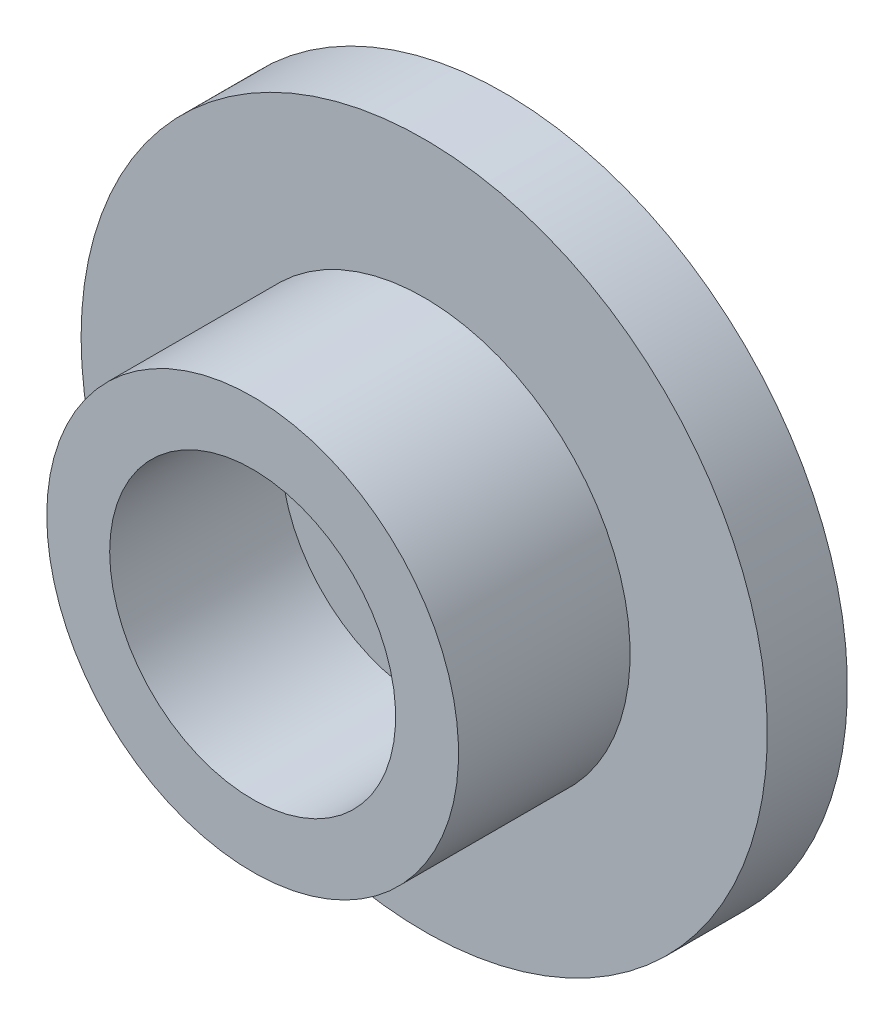
ISO-10303-21;
HEADER;
FILE_DESCRIPTION(('STEP AP214'),'2;1');
FILE_NAME('part.step','',(''),(''),'','','');
FILE_SCHEMA(('AUTOMOTIVE_DESIGN { 1 0 10303 214 1 1 1 1 }'));
ENDSEC;
DATA;
#1=APPLICATION_CONTEXT('core data for automotive mechanical design processes');
#2=APPLICATION_PROTOCOL_DEFINITION('international standard','automotive_design',2000,#1);
#3=PRODUCT_CONTEXT('',#1,'mechanical');
#4=PRODUCT('Part','Part','',(#3));
#5=PRODUCT_RELATED_PRODUCT_CATEGORY('part','',(#4));
#6=PRODUCT_DEFINITION_FORMATION('','',#4);
#7=PRODUCT_DEFINITION_CONTEXT('part definition',#1,'design');
#8=PRODUCT_DEFINITION('design','',#6,#7);
#9=PRODUCT_DEFINITION_SHAPE('','',#8);
#10=(LENGTH_UNIT() NAMED_UNIT(*) SI_UNIT(.MILLI.,.METRE.));
#11=(NAMED_UNIT(*) PLANE_ANGLE_UNIT() SI_UNIT($,.RADIAN.));
#12=(NAMED_UNIT(*) SI_UNIT($,.STERADIAN.) SOLID_ANGLE_UNIT());
#13=UNCERTAINTY_MEASURE_WITH_UNIT(LENGTH_MEASURE(1.E-05),#10,'distance_accuracy_value','');
#14=(GEOMETRIC_REPRESENTATION_CONTEXT(3) GLOBAL_UNCERTAINTY_ASSIGNED_CONTEXT((#13)) GLOBAL_UNIT_ASSIGNED_CONTEXT((#10,
#11,#12)) REPRESENTATION_CONTEXT('',''));
#15=CARTESIAN_POINT('',(0.,0.,0.));
#16=DIRECTION('',(0.,0.,1.));
#17=DIRECTION('',(1.,0.,0.));
#18=AXIS2_PLACEMENT_3D('',#15,#16,#17);
#19=CARTESIAN_POINT('',(0.,0.,0.));
#20=DIRECTION('',(0.,0.,1.));
#21=DIRECTION('',(1.,0.,0.));
#22=AXIS2_PLACEMENT_3D('',#19,#20,#21);
#23=PLANE('',#22);
#24=CARTESIAN_POINT('',(0.,0.,0.));
#25=DIRECTION('',(0.,0.,1.));
#26=DIRECTION('',(1.,0.,0.));
#27=AXIS2_PLACEMENT_3D('',#24,#25,#26);
#28=CIRCLE('',#27,18.);
#29=CARTESIAN_POINT('',(18.,0.,0.));
#30=VERTEX_POINT('',#29);
#31=EDGE_CURVE('E41',#30,#30,#28,.T.);
#32=ORIENTED_EDGE('',*,*,#31,.F.);
#33=EDGE_LOOP('',(#32));
#34=FACE_BOUND('',#33,.T.);
#35=CARTESIAN_POINT('',(0.,0.,0.));
#36=DIRECTION('',(0.,0.,1.));
#37=DIRECTION('',(1.,0.,0.));
#38=AXIS2_PLACEMENT_3D('',#35,#36,#37);
#39=CIRCLE('',#38,12.5);
#40=CARTESIAN_POINT('',(12.5,0.,0.));
#41=VERTEX_POINT('',#40);
#42=EDGE_CURVE('E56',#41,#41,#39,.T.);
#43=ORIENTED_EDGE('',*,*,#42,.T.);
#44=EDGE_LOOP('',(#43));
#45=FACE_BOUND('',#44,.T.);
#46=ADVANCED_FACE('F29',(#34,#45),#23,.F.);
#47=CARTESIAN_POINT('',(0.,0.,7.));
#48=DIRECTION('',(0.,0.,-1.));
#49=DIRECTION('',(-1.,0.,0.));
#50=AXIS2_PLACEMENT_3D('',#47,#48,#49);
#51=CYLINDRICAL_SURFACE('',#50,18.);
#52=CARTESIAN_POINT('',(0.,0.,7.));
#53=DIRECTION('',(0.,0.,-1.));
#54=DIRECTION('',(-1.,0.,0.));
#55=AXIS2_PLACEMENT_3D('',#52,#53,#54);
#56=CIRCLE('',#55,18.);
#57=CARTESIAN_POINT('',(-18.,0.,7.));
#58=VERTEX_POINT('',#57);
#59=EDGE_CURVE('E46',#58,#58,#56,.T.);
#60=ORIENTED_EDGE('',*,*,#59,.T.);
#61=EDGE_LOOP('',(#60));
#62=FACE_BOUND('',#61,.T.);
#63=ORIENTED_EDGE('',*,*,#31,.T.);
#64=EDGE_LOOP('',(#63));
#65=FACE_BOUND('',#64,.T.);
#66=ADVANCED_FACE('F31',(#62,#65),#51,.T.);
#67=CARTESIAN_POINT('',(0.,0.,7.));
#68=DIRECTION('',(0.,0.,-1.));
#69=DIRECTION('',(-1.,0.,0.));
#70=AXIS2_PLACEMENT_3D('',#67,#68,#69);
#71=CYLINDRICAL_SURFACE('',#70,12.5);
#72=CARTESIAN_POINT('',(0.,0.,7.));
#73=DIRECTION('',(0.,0.,-1.));
#74=DIRECTION('',(-1.,0.,0.));
#75=AXIS2_PLACEMENT_3D('',#72,#73,#74);
#76=CIRCLE('',#75,12.5);
#77=CARTESIAN_POINT('',(-12.5,0.,7.));
#78=VERTEX_POINT('',#77);
#79=EDGE_CURVE('E33',#78,#78,#76,.T.);
#80=ORIENTED_EDGE('',*,*,#79,.F.);
#81=EDGE_LOOP('',(#80));
#82=FACE_BOUND('',#81,.T.);
#83=ORIENTED_EDGE('',*,*,#42,.F.);
#84=EDGE_LOOP('',(#83));
#85=FACE_BOUND('',#84,.T.);
#86=ADVANCED_FACE('F94',(#82,#85),#71,.F.);
#87=CARTESIAN_POINT('',(0.,0.,7.));
#88=DIRECTION('',(0.,0.,-1.));
#89=DIRECTION('',(-1.,0.,0.));
#90=AXIS2_PLACEMENT_3D('',#87,#88,#89);
#91=PLANE('',#90);
#92=ORIENTED_EDGE('',*,*,#79,.T.);
#93=EDGE_LOOP('',(#92));
#94=FACE_BOUND('',#93,.T.);
#95=ADVANCED_FACE('F84',(#94),#91,.T.);
#96=CARTESIAN_POINT('',(0.,0.,7.));
#97=DIRECTION('',(0.,0.,-1.));
#98=DIRECTION('',(-1.,0.,0.));
#99=AXIS2_PLACEMENT_3D('',#96,#97,#98);
#100=CIRCLE('',#99,30.);
#101=CARTESIAN_POINT('',(-30.,0.,7.));
#102=VERTEX_POINT('',#101);
#103=EDGE_CURVE('E61',#102,#102,#100,.T.);
#104=ORIENTED_EDGE('',*,*,#103,.T.);
#105=EDGE_LOOP('',(#104));
#106=FACE_BOUND('',#105,.T.);
#107=ORIENTED_EDGE('',*,*,#59,.F.);
#108=EDGE_LOOP('',(#107));
#109=FACE_BOUND('',#108,.T.);
#110=ADVANCED_FACE('F74',(#106,#109),#91,.T.);
#111=CARTESIAN_POINT('',(0.,0.,14.));
#112=DIRECTION('',(0.,0.,-1.));
#113=DIRECTION('',(-1.,0.,0.));
#114=AXIS2_PLACEMENT_3D('',#111,#112,#113);
#115=PLANE('',#114);
#116=CARTESIAN_POINT('',(0.,0.,14.));
#117=DIRECTION('',(0.,0.,-1.));
#118=DIRECTION('',(-1.,0.,0.));
#119=AXIS2_PLACEMENT_3D('',#116,#117,#118);
#120=CIRCLE('',#119,30.);
#121=CARTESIAN_POINT('',(-30.,0.,14.));
#122=VERTEX_POINT('',#121);
#123=EDGE_CURVE('E44',#122,#122,#120,.T.);
#124=ORIENTED_EDGE('',*,*,#123,.F.);
#125=EDGE_LOOP('',(#124));
#126=FACE_BOUND('',#125,.T.);
#127=CARTESIAN_POINT('',(0.,0.,14.));
#128=DIRECTION('',(0.,0.,-1.));
#129=DIRECTION('',(-1.,0.,0.));
#130=AXIS2_PLACEMENT_3D('',#127,#128,#129);
#131=CIRCLE('',#130,18.);
#132=CARTESIAN_POINT('',(-18.,0.,14.));
#133=VERTEX_POINT('',#132);
#134=EDGE_CURVE('E10',#133,#133,#131,.T.);
#135=ORIENTED_EDGE('',*,*,#134,.T.);
#136=EDGE_LOOP('',(#135));
#137=FACE_BOUND('',#136,.T.);
#138=ADVANCED_FACE('F72',(#126,#137),#115,.F.);
#139=CARTESIAN_POINT('',(0.,0.,7.));
#140=DIRECTION('',(0.,0.,1.));
#141=DIRECTION('',(1.,0.,0.));
#142=AXIS2_PLACEMENT_3D('',#139,#140,#141);
#143=CYLINDRICAL_SURFACE('',#142,30.);
#144=ORIENTED_EDGE('',*,*,#103,.F.);
#145=EDGE_LOOP('',(#144));
#146=FACE_BOUND('',#145,.T.);
#147=ORIENTED_EDGE('',*,*,#123,.T.);
#148=EDGE_LOOP('',(#147));
#149=FACE_BOUND('',#148,.T.);
#150=ADVANCED_FACE('F70',(#146,#149),#143,.T.);
#151=CARTESIAN_POINT('',(0.,0.,29.));
#152=DIRECTION('',(0.,0.,-1.));
#153=DIRECTION('',(-1.,0.,0.));
#154=AXIS2_PLACEMENT_3D('',#151,#152,#153);
#155=CIRCLE('',#154,18.);
#156=CARTESIAN_POINT('',(-18.,0.,29.));
#157=VERTEX_POINT('',#156);
#158=EDGE_CURVE('E49',#157,#157,#155,.T.);
#159=ORIENTED_EDGE('',*,*,#158,.T.);
#160=EDGE_LOOP('',(#159));
#161=FACE_BOUND('',#160,.T.);
#162=ORIENTED_EDGE('',*,*,#134,.F.);
#163=EDGE_LOOP('',(#162));
#164=FACE_BOUND('',#163,.T.);
#165=ADVANCED_FACE('F81',(#161,#164),#51,.T.);
#166=CARTESIAN_POINT('',(-0.0760092222865243,-0.0311805987813774,29.));
#167=DIRECTION('',(0.,0.,-1.));
#168=DIRECTION('',(-0.999999411409528,-0.00108497953826524,0.));
#169=AXIS2_PLACEMENT_3D('',#166,#167,#168);
#170=PLANE('',#169);
#171=CARTESIAN_POINT('',(0.,0.,29.));
#172=DIRECTION('',(0.,0.,-1.));
#173=DIRECTION('',(-1.,0.,0.));
#174=AXIS2_PLACEMENT_3D('',#171,#172,#173);
#175=CIRCLE('',#174,12.5);
#176=CARTESIAN_POINT('',(-12.5,0.,29.));
#177=VERTEX_POINT('',#176);
#178=EDGE_CURVE('E53',#177,#177,#175,.T.);
#179=ORIENTED_EDGE('',*,*,#178,.T.);
#180=EDGE_LOOP('',(#179));
#181=FACE_BOUND('',#180,.T.);
#182=ORIENTED_EDGE('',*,*,#158,.F.);
#183=EDGE_LOOP('',(#182));
#184=FACE_BOUND('',#183,.T.);
#185=ADVANCED_FACE('F102',(#181,#184),#170,.F.);
#186=ORIENTED_EDGE('',*,*,#178,.F.);
#187=EDGE_LOOP('',(#186));
#188=FACE_BOUND('',#187,.T.);
#189=CARTESIAN_POINT('',(0.,0.,14.));
#190=DIRECTION('',(0.,0.,-1.));
#191=DIRECTION('',(-1.,0.,0.));
#192=AXIS2_PLACEMENT_3D('',#189,#190,#191);
#193=CIRCLE('',#192,12.5);
#194=CARTESIAN_POINT('',(-12.5,0.,14.));
#195=VERTEX_POINT('',#194);
#196=EDGE_CURVE('E50',#195,#195,#193,.T.);
#197=ORIENTED_EDGE('',*,*,#196,.T.);
#198=EDGE_LOOP('',(#197));
#199=FACE_BOUND('',#198,.T.);
#200=ADVANCED_FACE('F87',(#188,#199),#71,.F.);
#201=ORIENTED_EDGE('',*,*,#196,.F.);
#202=EDGE_LOOP('',(#201));
#203=FACE_BOUND('',#202,.T.);
#204=ADVANCED_FACE('F76',(#203),#115,.F.);
#205=CLOSED_SHELL('',(#46,#66,#86,#95,#110,#138,#150,#165,#185,#200,#204));
#206=MANIFOLD_SOLID_BREP('B2',#205);
#207=ADVANCED_BREP_SHAPE_REPRESENTATION('',(#18,#206),#14);
#208=SHAPE_DEFINITION_REPRESENTATION(#9,#207);
ENDSEC;
END-ISO-10303-21;
